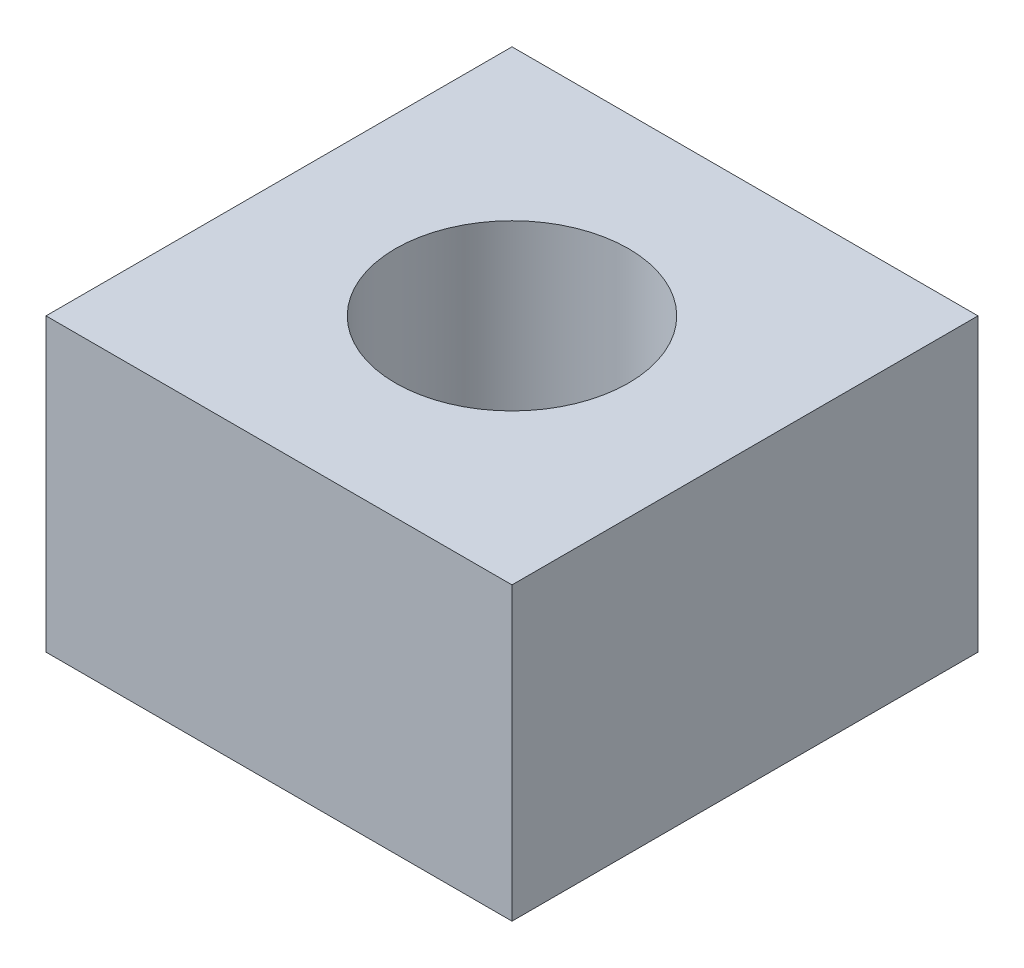
ISO-10303-21;
HEADER;
FILE_DESCRIPTION(('STEP AP214'),'2;1');
FILE_NAME('part.step','',(''),(''),'','','');
FILE_SCHEMA(('AUTOMOTIVE_DESIGN { 1 0 10303 214 1 1 1 1 }'));
ENDSEC;
DATA;
#1=APPLICATION_CONTEXT('core data for automotive mechanical design processes');
#2=APPLICATION_PROTOCOL_DEFINITION('international standard','automotive_design',2000,#1);
#3=PRODUCT_CONTEXT('',#1,'mechanical');
#4=PRODUCT('Part','Part','',(#3));
#5=PRODUCT_RELATED_PRODUCT_CATEGORY('part','',(#4));
#6=PRODUCT_DEFINITION_FORMATION('','',#4);
#7=PRODUCT_DEFINITION_CONTEXT('part definition',#1,'design');
#8=PRODUCT_DEFINITION('design','',#6,#7);
#9=PRODUCT_DEFINITION_SHAPE('','',#8);
#10=(LENGTH_UNIT() NAMED_UNIT(*) SI_UNIT(.MILLI.,.METRE.));
#11=(NAMED_UNIT(*) PLANE_ANGLE_UNIT() SI_UNIT($,.RADIAN.));
#12=(NAMED_UNIT(*) SI_UNIT($,.STERADIAN.) SOLID_ANGLE_UNIT());
#13=UNCERTAINTY_MEASURE_WITH_UNIT(LENGTH_MEASURE(1.E-05),#10,'distance_accuracy_value','');
#14=(GEOMETRIC_REPRESENTATION_CONTEXT(3) GLOBAL_UNCERTAINTY_ASSIGNED_CONTEXT((#13)) GLOBAL_UNIT_ASSIGNED_CONTEXT((#10,
#11,#12)) REPRESENTATION_CONTEXT('',''));
#15=CARTESIAN_POINT('',(0.,0.,0.));
#16=DIRECTION('',(0.,0.,1.));
#17=DIRECTION('',(1.,0.,0.));
#18=AXIS2_PLACEMENT_3D('',#15,#16,#17);
#19=CARTESIAN_POINT('',(0.,50.,0.));
#20=DIRECTION('',(0.,-1.,0.));
#21=DIRECTION('',(0.,0.,-1.));
#22=AXIS2_PLACEMENT_3D('',#19,#20,#21);
#23=PLANE('',#22);
#24=DIRECTION('',(0.,0.,1.));
#25=VECTOR('',#24,1.);
#26=CARTESIAN_POINT('',(-40.,50.,40.));
#27=LINE('',#26,#25);
#28=CARTESIAN_POINT('',(-40.,50.,-40.));
#29=VERTEX_POINT('',#28);
#30=CARTESIAN_POINT('',(-40.,50.,40.));
#31=VERTEX_POINT('',#30);
#32=EDGE_CURVE('E98',#29,#31,#27,.T.);
#33=ORIENTED_EDGE('',*,*,#32,.T.);
#34=DIRECTION('',(1.,0.,0.));
#35=VECTOR('',#34,1.);
#36=CARTESIAN_POINT('',(40.,50.,40.));
#37=LINE('',#36,#35);
#38=CARTESIAN_POINT('',(40.,50.,40.));
#39=VERTEX_POINT('',#38);
#40=EDGE_CURVE('E93',#31,#39,#37,.T.);
#41=ORIENTED_EDGE('',*,*,#40,.T.);
#42=DIRECTION('',(0.,0.,-1.));
#43=VECTOR('',#42,1.);
#44=CARTESIAN_POINT('',(40.,50.,-40.));
#45=LINE('',#44,#43);
#46=CARTESIAN_POINT('',(40.,50.,-40.));
#47=VERTEX_POINT('',#46);
#48=EDGE_CURVE('E96',#39,#47,#45,.T.);
#49=ORIENTED_EDGE('',*,*,#48,.T.);
#50=DIRECTION('',(-1.,0.,0.));
#51=VECTOR('',#50,1.);
#52=CARTESIAN_POINT('',(-40.,50.,-40.));
#53=LINE('',#52,#51);
#54=EDGE_CURVE('E63',#47,#29,#53,.T.);
#55=ORIENTED_EDGE('',*,*,#54,.T.);
#56=EDGE_LOOP('',(#33,#41,#49,#55));
#57=FACE_BOUND('',#56,.T.);
#58=CARTESIAN_POINT('',(0.,50.,0.));
#59=DIRECTION('',(0.,1.,0.));
#60=DIRECTION('',(0.,0.,1.));
#61=AXIS2_PLACEMENT_3D('',#58,#59,#60);
#62=CIRCLE('',#61,20.);
#63=CARTESIAN_POINT('',(0.,50.,20.));
#64=VERTEX_POINT('',#63);
#65=EDGE_CURVE('E118',#64,#64,#62,.T.);
#66=ORIENTED_EDGE('',*,*,#65,.F.);
#67=EDGE_LOOP('',(#66));
#68=FACE_BOUND('',#67,.T.);
#69=ADVANCED_FACE('F45',(#57,#68),#23,.F.);
#70=CARTESIAN_POINT('',(0.,0.,0.));
#71=DIRECTION('',(0.,-1.,0.));
#72=DIRECTION('',(0.,0.,-1.));
#73=AXIS2_PLACEMENT_3D('',#70,#71,#72);
#74=PLANE('',#73);
#75=DIRECTION('',(0.,0.,1.));
#76=VECTOR('',#75,1.);
#77=CARTESIAN_POINT('',(-40.,0.,40.));
#78=LINE('',#77,#76);
#79=CARTESIAN_POINT('',(-40.,0.,-40.));
#80=VERTEX_POINT('',#79);
#81=CARTESIAN_POINT('',(-40.,0.,40.));
#82=VERTEX_POINT('',#81);
#83=EDGE_CURVE('E114',#80,#82,#78,.T.);
#84=ORIENTED_EDGE('',*,*,#83,.F.);
#85=DIRECTION('',(-1.,0.,0.));
#86=VECTOR('',#85,1.);
#87=CARTESIAN_POINT('',(-40.,0.,-40.));
#88=LINE('',#87,#86);
#89=CARTESIAN_POINT('',(40.,0.,-40.));
#90=VERTEX_POINT('',#89);
#91=EDGE_CURVE('E86',#90,#80,#88,.T.);
#92=ORIENTED_EDGE('',*,*,#91,.F.);
#93=DIRECTION('',(0.,0.,-1.));
#94=VECTOR('',#93,1.);
#95=CARTESIAN_POINT('',(40.,0.,-40.));
#96=LINE('',#95,#94);
#97=CARTESIAN_POINT('',(40.,0.,40.));
#98=VERTEX_POINT('',#97);
#99=EDGE_CURVE('E80',#98,#90,#96,.T.);
#100=ORIENTED_EDGE('',*,*,#99,.F.);
#101=DIRECTION('',(1.,0.,0.));
#102=VECTOR('',#101,1.);
#103=CARTESIAN_POINT('',(40.,0.,40.));
#104=LINE('',#103,#102);
#105=EDGE_CURVE('E103',#82,#98,#104,.T.);
#106=ORIENTED_EDGE('',*,*,#105,.F.);
#107=EDGE_LOOP('',(#84,#92,#100,#106));
#108=FACE_BOUND('',#107,.T.);
#109=CARTESIAN_POINT('',(0.,0.,0.));
#110=DIRECTION('',(0.,1.,0.));
#111=DIRECTION('',(0.,0.,1.));
#112=AXIS2_PLACEMENT_3D('',#109,#110,#111);
#113=CIRCLE('',#112,20.);
#114=CARTESIAN_POINT('',(0.,0.,20.));
#115=VERTEX_POINT('',#114);
#116=EDGE_CURVE('E136',#115,#115,#113,.T.);
#117=ORIENTED_EDGE('',*,*,#116,.T.);
#118=EDGE_LOOP('',(#117));
#119=FACE_BOUND('',#118,.T.);
#120=ADVANCED_FACE('F131',(#108,#119),#74,.T.);
#121=CARTESIAN_POINT('',(-40.,50.,40.));
#122=DIRECTION('',(1.,0.,0.));
#123=DIRECTION('',(0.,0.,-1.));
#124=AXIS2_PLACEMENT_3D('',#121,#122,#123);
#125=PLANE('',#124);
#126=ORIENTED_EDGE('',*,*,#83,.T.);
#127=DIRECTION('',(0.,-1.,0.));
#128=VECTOR('',#127,1.);
#129=CARTESIAN_POINT('',(-40.,50.,40.));
#130=LINE('',#129,#128);
#131=EDGE_CURVE('E11',#31,#82,#130,.T.);
#132=ORIENTED_EDGE('',*,*,#131,.F.);
#133=ORIENTED_EDGE('',*,*,#32,.F.);
#134=DIRECTION('',(0.,-1.,0.));
#135=VECTOR('',#134,1.);
#136=CARTESIAN_POINT('',(-40.,50.,-40.));
#137=LINE('',#136,#135);
#138=EDGE_CURVE('E110',#29,#80,#137,.T.);
#139=ORIENTED_EDGE('',*,*,#138,.T.);
#140=EDGE_LOOP('',(#126,#132,#133,#139));
#141=FACE_BOUND('',#140,.T.);
#142=ADVANCED_FACE('F47',(#141),#125,.F.);
#143=CARTESIAN_POINT('',(40.,50.,40.));
#144=DIRECTION('',(0.,0.,-1.));
#145=DIRECTION('',(-1.,0.,0.));
#146=AXIS2_PLACEMENT_3D('',#143,#144,#145);
#147=PLANE('',#146);
#148=ORIENTED_EDGE('',*,*,#105,.T.);
#149=DIRECTION('',(0.,-1.,0.));
#150=VECTOR('',#149,1.);
#151=CARTESIAN_POINT('',(40.,50.,40.));
#152=LINE('',#151,#150);
#153=EDGE_CURVE('E55',#39,#98,#152,.T.);
#154=ORIENTED_EDGE('',*,*,#153,.F.);
#155=ORIENTED_EDGE('',*,*,#40,.F.);
#156=ORIENTED_EDGE('',*,*,#131,.T.);
#157=EDGE_LOOP('',(#148,#154,#155,#156));
#158=FACE_BOUND('',#157,.T.);
#159=ADVANCED_FACE('F102',(#158),#147,.F.);
#160=CARTESIAN_POINT('',(40.,50.,-40.));
#161=DIRECTION('',(-1.,0.,0.));
#162=DIRECTION('',(0.,0.,1.));
#163=AXIS2_PLACEMENT_3D('',#160,#161,#162);
#164=PLANE('',#163);
#165=ORIENTED_EDGE('',*,*,#99,.T.);
#166=DIRECTION('',(0.,-1.,0.));
#167=VECTOR('',#166,1.);
#168=CARTESIAN_POINT('',(40.,50.,-40.));
#169=LINE('',#168,#167);
#170=EDGE_CURVE('E105',#47,#90,#169,.T.);
#171=ORIENTED_EDGE('',*,*,#170,.F.);
#172=ORIENTED_EDGE('',*,*,#48,.F.);
#173=ORIENTED_EDGE('',*,*,#153,.T.);
#174=EDGE_LOOP('',(#165,#171,#172,#173));
#175=FACE_BOUND('',#174,.T.);
#176=ADVANCED_FACE('F106',(#175),#164,.F.);
#177=CARTESIAN_POINT('',(-40.,50.,-40.));
#178=DIRECTION('',(0.,0.,1.));
#179=DIRECTION('',(1.,0.,0.));
#180=AXIS2_PLACEMENT_3D('',#177,#178,#179);
#181=PLANE('',#180);
#182=ORIENTED_EDGE('',*,*,#91,.T.);
#183=ORIENTED_EDGE('',*,*,#138,.F.);
#184=ORIENTED_EDGE('',*,*,#54,.F.);
#185=ORIENTED_EDGE('',*,*,#170,.T.);
#186=EDGE_LOOP('',(#182,#183,#184,#185));
#187=FACE_BOUND('',#186,.T.);
#188=ADVANCED_FACE('F128',(#187),#181,.F.);
#189=CARTESIAN_POINT('',(0.,50.,0.));
#190=DIRECTION('',(0.,-1.,0.));
#191=DIRECTION('',(0.,0.,-1.));
#192=AXIS2_PLACEMENT_3D('',#189,#190,#191);
#193=CYLINDRICAL_SURFACE('',#192,20.);
#194=ORIENTED_EDGE('',*,*,#65,.T.);
#195=EDGE_LOOP('',(#194));
#196=FACE_BOUND('',#195,.T.);
#197=ORIENTED_EDGE('',*,*,#116,.F.);
#198=EDGE_LOOP('',(#197));
#199=FACE_BOUND('',#198,.T.);
#200=ADVANCED_FACE('F144',(#196,#199),#193,.F.);
#201=CLOSED_SHELL('',(#69,#120,#142,#159,#176,#188,#200));
#202=MANIFOLD_SOLID_BREP('B2',#201);
#203=ADVANCED_BREP_SHAPE_REPRESENTATION('',(#18,#202),#14);
#204=SHAPE_DEFINITION_REPRESENTATION(#9,#203);
ENDSEC;
END-ISO-10303-21;
